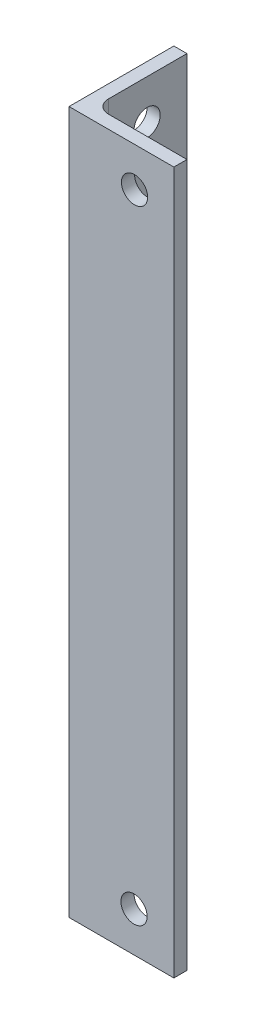
ISO-10303-21;
HEADER;
FILE_DESCRIPTION(('STEP AP214'),'2;1');
FILE_NAME('part.step','',(''),(''),'','','');
FILE_SCHEMA(('AUTOMOTIVE_DESIGN { 1 0 10303 214 1 1 1 1 }'));
ENDSEC;
DATA;
#1=APPLICATION_CONTEXT('core data for automotive mechanical design processes');
#2=APPLICATION_PROTOCOL_DEFINITION('international standard','automotive_design',2000,#1);
#3=PRODUCT_CONTEXT('',#1,'mechanical');
#4=PRODUCT('Part','Part','',(#3));
#5=PRODUCT_RELATED_PRODUCT_CATEGORY('part','',(#4));
#6=PRODUCT_DEFINITION_FORMATION('','',#4);
#7=PRODUCT_DEFINITION_CONTEXT('part definition',#1,'design');
#8=PRODUCT_DEFINITION('design','',#6,#7);
#9=PRODUCT_DEFINITION_SHAPE('','',#8);
#10=(LENGTH_UNIT() NAMED_UNIT(*) SI_UNIT(.MILLI.,.METRE.));
#11=(NAMED_UNIT(*) PLANE_ANGLE_UNIT() SI_UNIT($,.RADIAN.));
#12=(NAMED_UNIT(*) SI_UNIT($,.STERADIAN.) SOLID_ANGLE_UNIT());
#13=UNCERTAINTY_MEASURE_WITH_UNIT(LENGTH_MEASURE(1.E-05),#10,'distance_accuracy_value','');
#14=(GEOMETRIC_REPRESENTATION_CONTEXT(3) GLOBAL_UNCERTAINTY_ASSIGNED_CONTEXT((#13)) GLOBAL_UNIT_ASSIGNED_CONTEXT((#10,
#11,#12)) REPRESENTATION_CONTEXT('',''));
#15=CARTESIAN_POINT('',(0.,0.,0.));
#16=DIRECTION('',(0.,0.,1.));
#17=DIRECTION('',(1.,0.,0.));
#18=AXIS2_PLACEMENT_3D('',#15,#16,#17);
#19=CARTESIAN_POINT('',(0.,170.18,25.4));
#20=DIRECTION('',(1.,0.,0.));
#21=DIRECTION('',(0.,0.,-1.));
#22=AXIS2_PLACEMENT_3D('',#19,#20,#21);
#23=PLANE('',#22);
#24=CARTESIAN_POINT('',(0.,9.65199999999999,9.652));
#25=DIRECTION('',(-1.,0.,0.));
#26=DIRECTION('',(0.,0.,1.));
#27=AXIS2_PLACEMENT_3D('',#24,#25,#26);
#28=CIRCLE('',#27,3.175);
#29=CARTESIAN_POINT('',(0.,9.65199999999999,12.827));
#30=VERTEX_POINT('',#29);
#31=EDGE_CURVE('E147',#30,#30,#28,.T.);
#32=ORIENTED_EDGE('',*,*,#31,.F.);
#33=EDGE_LOOP('',(#32));
#34=FACE_BOUND('',#33,.T.);
#35=CARTESIAN_POINT('',(0.,160.528,9.652));
#36=DIRECTION('',(-1.,0.,0.));
#37=DIRECTION('',(0.,0.,1.));
#38=AXIS2_PLACEMENT_3D('',#35,#36,#37);
#39=CIRCLE('',#38,3.175);
#40=CARTESIAN_POINT('',(0.,160.528,12.827));
#41=VERTEX_POINT('',#40);
#42=EDGE_CURVE('E137',#41,#41,#39,.T.);
#43=ORIENTED_EDGE('',*,*,#42,.F.);
#44=EDGE_LOOP('',(#43));
#45=FACE_BOUND('',#44,.T.);
#46=DIRECTION('',(0.,0.,1.));
#47=VECTOR('',#46,1.);
#48=CARTESIAN_POINT('',(0.,0.,25.4));
#49=LINE('',#48,#47);
#50=CARTESIAN_POINT('',(0.,0.,0.));
#51=VERTEX_POINT('',#50);
#52=CARTESIAN_POINT('',(0.,0.,25.4));
#53=VERTEX_POINT('',#52);
#54=EDGE_CURVE('E125',#51,#53,#49,.T.);
#55=ORIENTED_EDGE('',*,*,#54,.T.);
#56=DIRECTION('',(0.,-1.,0.));
#57=VECTOR('',#56,1.);
#58=CARTESIAN_POINT('',(0.,170.18,25.4));
#59=LINE('',#58,#57);
#60=CARTESIAN_POINT('',(0.,170.18,25.4));
#61=VERTEX_POINT('',#60);
#62=EDGE_CURVE('E106',#61,#53,#59,.T.);
#63=ORIENTED_EDGE('',*,*,#62,.F.);
#64=DIRECTION('',(0.,0.,1.));
#65=VECTOR('',#64,1.);
#66=CARTESIAN_POINT('',(0.,170.18,25.4));
#67=LINE('',#66,#65);
#68=CARTESIAN_POINT('',(0.,170.18,0.));
#69=VERTEX_POINT('',#68);
#70=EDGE_CURVE('E113',#69,#61,#67,.T.);
#71=ORIENTED_EDGE('',*,*,#70,.F.);
#72=DIRECTION('',(0.,-1.,0.));
#73=VECTOR('',#72,1.);
#74=CARTESIAN_POINT('',(0.,170.18,0.));
#75=LINE('',#74,#73);
#76=EDGE_CURVE('E156',#69,#51,#75,.T.);
#77=ORIENTED_EDGE('',*,*,#76,.T.);
#78=EDGE_LOOP('',(#55,#63,#71,#77));
#79=FACE_BOUND('',#78,.T.);
#80=ADVANCED_FACE('F41',(#34,#45,#79),#23,.F.);
#81=CARTESIAN_POINT('',(25.4,170.18,25.4));
#82=DIRECTION('',(0.,0.,-1.));
#83=DIRECTION('',(-1.,0.,0.));
#84=AXIS2_PLACEMENT_3D('',#81,#82,#83);
#85=PLANE('',#84);
#86=CARTESIAN_POINT('',(15.875,160.655,25.4));
#87=DIRECTION('',(0.,0.,-1.));
#88=DIRECTION('',(-1.,0.,0.));
#89=AXIS2_PLACEMENT_3D('',#86,#87,#88);
#90=CIRCLE('',#89,3.175);
#91=CARTESIAN_POINT('',(12.7,160.655,25.4));
#92=VERTEX_POINT('',#91);
#93=EDGE_CURVE('E223',#92,#92,#90,.T.);
#94=ORIENTED_EDGE('',*,*,#93,.T.);
#95=EDGE_LOOP('',(#94));
#96=FACE_BOUND('',#95,.T.);
#97=CARTESIAN_POINT('',(15.748,9.65199999999999,25.4));
#98=DIRECTION('',(0.,0.,-1.));
#99=DIRECTION('',(-1.,0.,0.));
#100=AXIS2_PLACEMENT_3D('',#97,#98,#99);
#101=CIRCLE('',#100,3.175);
#102=CARTESIAN_POINT('',(12.573,9.65199999999999,25.4));
#103=VERTEX_POINT('',#102);
#104=EDGE_CURVE('E222',#103,#103,#101,.T.);
#105=ORIENTED_EDGE('',*,*,#104,.T.);
#106=EDGE_LOOP('',(#105));
#107=FACE_BOUND('',#106,.T.);
#108=DIRECTION('',(1.,0.,0.));
#109=VECTOR('',#108,1.);
#110=CARTESIAN_POINT('',(25.4,0.,25.4));
#111=LINE('',#110,#109);
#112=CARTESIAN_POINT('',(25.4,0.,25.4));
#113=VERTEX_POINT('',#112);
#114=EDGE_CURVE('E140',#53,#113,#111,.T.);
#115=ORIENTED_EDGE('',*,*,#114,.T.);
#116=DIRECTION('',(0.,-1.,0.));
#117=VECTOR('',#116,1.);
#118=CARTESIAN_POINT('',(25.4,170.18,25.4));
#119=LINE('',#118,#117);
#120=CARTESIAN_POINT('',(25.4,170.18,25.4));
#121=VERTEX_POINT('',#120);
#122=EDGE_CURVE('E109',#121,#113,#119,.T.);
#123=ORIENTED_EDGE('',*,*,#122,.F.);
#124=DIRECTION('',(1.,0.,0.));
#125=VECTOR('',#124,1.);
#126=CARTESIAN_POINT('',(25.4,170.18,25.4));
#127=LINE('',#126,#125);
#128=EDGE_CURVE('E102',#61,#121,#127,.T.);
#129=ORIENTED_EDGE('',*,*,#128,.F.);
#130=ORIENTED_EDGE('',*,*,#62,.T.);
#131=EDGE_LOOP('',(#115,#123,#129,#130));
#132=FACE_BOUND('',#131,.T.);
#133=ADVANCED_FACE('F104',(#96,#107,#132),#85,.F.);
#134=CARTESIAN_POINT('',(25.4,170.18,22.225));
#135=DIRECTION('',(-1.,0.,0.));
#136=DIRECTION('',(0.,0.,1.));
#137=AXIS2_PLACEMENT_3D('',#134,#135,#136);
#138=PLANE('',#137);
#139=DIRECTION('',(0.,0.,-1.));
#140=VECTOR('',#139,1.);
#141=CARTESIAN_POINT('',(25.4,0.,22.225));
#142=LINE('',#141,#140);
#143=CARTESIAN_POINT('',(25.4,0.,22.225));
#144=VERTEX_POINT('',#143);
#145=EDGE_CURVE('E159',#113,#144,#142,.T.);
#146=ORIENTED_EDGE('',*,*,#145,.T.);
#147=DIRECTION('',(0.,-1.,0.));
#148=VECTOR('',#147,1.);
#149=CARTESIAN_POINT('',(25.4,170.18,22.225));
#150=LINE('',#149,#148);
#151=CARTESIAN_POINT('',(25.4,170.18,22.225));
#152=VERTEX_POINT('',#151);
#153=EDGE_CURVE('E130',#152,#144,#150,.T.);
#154=ORIENTED_EDGE('',*,*,#153,.F.);
#155=DIRECTION('',(0.,0.,-1.));
#156=VECTOR('',#155,1.);
#157=CARTESIAN_POINT('',(25.4,170.18,22.225));
#158=LINE('',#157,#156);
#159=EDGE_CURVE('E112',#121,#152,#158,.T.);
#160=ORIENTED_EDGE('',*,*,#159,.F.);
#161=ORIENTED_EDGE('',*,*,#122,.T.);
#162=EDGE_LOOP('',(#146,#154,#160,#161));
#163=FACE_BOUND('',#162,.T.);
#164=ADVANCED_FACE('F175',(#163),#138,.F.);
#165=CARTESIAN_POINT('',(3.175,170.18,22.225));
#166=DIRECTION('',(0.,0.,1.));
#167=DIRECTION('',(1.,0.,0.));
#168=AXIS2_PLACEMENT_3D('',#165,#166,#167);
#169=PLANE('',#168);
#170=CARTESIAN_POINT('',(15.875,160.655,22.225));
#171=DIRECTION('',(0.,0.,-1.));
#172=DIRECTION('',(-1.,0.,0.));
#173=AXIS2_PLACEMENT_3D('',#170,#171,#172);
#174=CIRCLE('',#173,3.175);
#175=CARTESIAN_POINT('',(12.7,160.655,22.225));
#176=VERTEX_POINT('',#175);
#177=EDGE_CURVE('E217',#176,#176,#174,.T.);
#178=ORIENTED_EDGE('',*,*,#177,.F.);
#179=EDGE_LOOP('',(#178));
#180=FACE_BOUND('',#179,.T.);
#181=CARTESIAN_POINT('',(15.748,9.65199999999999,22.225));
#182=DIRECTION('',(0.,0.,-1.));
#183=DIRECTION('',(-1.,0.,0.));
#184=AXIS2_PLACEMENT_3D('',#181,#182,#183);
#185=CIRCLE('',#184,3.175);
#186=CARTESIAN_POINT('',(12.573,9.65199999999999,22.225));
#187=VERTEX_POINT('',#186);
#188=EDGE_CURVE('E220',#187,#187,#185,.T.);
#189=ORIENTED_EDGE('',*,*,#188,.F.);
#190=EDGE_LOOP('',(#189));
#191=FACE_BOUND('',#190,.T.);
#192=DIRECTION('',(-1.,0.,0.));
#193=VECTOR('',#192,1.);
#194=CARTESIAN_POINT('',(3.175,0.,22.225));
#195=LINE('',#194,#193);
#196=CARTESIAN_POINT('',(6.35,0.,22.225));
#197=VERTEX_POINT('',#196);
#198=EDGE_CURVE('E161',#144,#197,#195,.T.);
#199=ORIENTED_EDGE('',*,*,#198,.T.);
#200=DIRECTION('',(0.,-1.,0.));
#201=VECTOR('',#200,1.);
#202=CARTESIAN_POINT('',(6.35,170.18,22.225));
#203=LINE('',#202,#201);
#204=CARTESIAN_POINT('',(6.35,170.18,22.225));
#205=VERTEX_POINT('',#204);
#206=EDGE_CURVE('E58',#197,#205,#203,.F.);
#207=ORIENTED_EDGE('',*,*,#206,.T.);
#208=DIRECTION('',(-1.,0.,0.));
#209=VECTOR('',#208,1.);
#210=CARTESIAN_POINT('',(3.175,170.18,22.225));
#211=LINE('',#210,#209);
#212=EDGE_CURVE('E152',#152,#205,#211,.T.);
#213=ORIENTED_EDGE('',*,*,#212,.F.);
#214=ORIENTED_EDGE('',*,*,#153,.T.);
#215=EDGE_LOOP('',(#199,#207,#213,#214));
#216=FACE_BOUND('',#215,.T.);
#217=ADVANCED_FACE('F171',(#180,#191,#216),#169,.F.);
#218=CARTESIAN_POINT('',(3.175,170.18,0.));
#219=DIRECTION('',(-1.,0.,0.));
#220=DIRECTION('',(0.,0.,1.));
#221=AXIS2_PLACEMENT_3D('',#218,#219,#220);
#222=PLANE('',#221);
#223=CARTESIAN_POINT('',(3.175,9.65199999999999,9.652));
#224=DIRECTION('',(-1.,0.,0.));
#225=DIRECTION('',(0.,0.,1.));
#226=AXIS2_PLACEMENT_3D('',#223,#224,#225);
#227=CIRCLE('',#226,3.175);
#228=CARTESIAN_POINT('',(3.175,9.65199999999999,12.827));
#229=VERTEX_POINT('',#228);
#230=EDGE_CURVE('E45',#229,#229,#227,.T.);
#231=ORIENTED_EDGE('',*,*,#230,.T.);
#232=EDGE_LOOP('',(#231));
#233=FACE_BOUND('',#232,.T.);
#234=CARTESIAN_POINT('',(3.175,160.528,9.652));
#235=DIRECTION('',(-1.,0.,0.));
#236=DIRECTION('',(0.,0.,1.));
#237=AXIS2_PLACEMENT_3D('',#234,#235,#236);
#238=CIRCLE('',#237,3.175);
#239=CARTESIAN_POINT('',(3.175,160.528,12.827));
#240=VERTEX_POINT('',#239);
#241=EDGE_CURVE('E135',#240,#240,#238,.T.);
#242=ORIENTED_EDGE('',*,*,#241,.T.);
#243=EDGE_LOOP('',(#242));
#244=FACE_BOUND('',#243,.T.);
#245=DIRECTION('',(0.,0.,-1.));
#246=VECTOR('',#245,1.);
#247=CARTESIAN_POINT('',(3.175,170.18,0.));
#248=LINE('',#247,#246);
#249=CARTESIAN_POINT('',(3.175,170.18,19.05));
#250=VERTEX_POINT('',#249);
#251=CARTESIAN_POINT('',(3.175,170.18,0.));
#252=VERTEX_POINT('',#251);
#253=EDGE_CURVE('E154',#250,#252,#248,.T.);
#254=ORIENTED_EDGE('',*,*,#253,.F.);
#255=DIRECTION('',(0.,-1.,0.));
#256=VECTOR('',#255,1.);
#257=CARTESIAN_POINT('',(3.175,0.,19.05));
#258=LINE('',#257,#256);
#259=CARTESIAN_POINT('',(3.175,0.,19.05));
#260=VERTEX_POINT('',#259);
#261=EDGE_CURVE('E126',#250,#260,#258,.T.);
#262=ORIENTED_EDGE('',*,*,#261,.T.);
#263=DIRECTION('',(0.,0.,-1.));
#264=VECTOR('',#263,1.);
#265=CARTESIAN_POINT('',(3.175,0.,0.));
#266=LINE('',#265,#264);
#267=CARTESIAN_POINT('',(3.175,0.,0.));
#268=VERTEX_POINT('',#267);
#269=EDGE_CURVE('E163',#260,#268,#266,.T.);
#270=ORIENTED_EDGE('',*,*,#269,.T.);
#271=DIRECTION('',(0.,-1.,0.));
#272=VECTOR('',#271,1.);
#273=CARTESIAN_POINT('',(3.175,170.18,0.));
#274=LINE('',#273,#272);
#275=EDGE_CURVE('E167',#252,#268,#274,.T.);
#276=ORIENTED_EDGE('',*,*,#275,.F.);
#277=EDGE_LOOP('',(#254,#262,#270,#276));
#278=FACE_BOUND('',#277,.T.);
#279=ADVANCED_FACE('F181',(#233,#244,#278),#222,.F.);
#280=CARTESIAN_POINT('',(0.,170.18,0.));
#281=DIRECTION('',(0.,0.,1.));
#282=DIRECTION('',(1.,0.,0.));
#283=AXIS2_PLACEMENT_3D('',#280,#281,#282);
#284=PLANE('',#283);
#285=DIRECTION('',(-1.,0.,0.));
#286=VECTOR('',#285,1.);
#287=CARTESIAN_POINT('',(0.,0.,0.));
#288=LINE('',#287,#286);
#289=EDGE_CURVE('E122',#268,#51,#288,.T.);
#290=ORIENTED_EDGE('',*,*,#289,.T.);
#291=ORIENTED_EDGE('',*,*,#76,.F.);
#292=DIRECTION('',(-1.,0.,0.));
#293=VECTOR('',#292,1.);
#294=CARTESIAN_POINT('',(0.,170.18,0.));
#295=LINE('',#294,#293);
#296=EDGE_CURVE('E118',#252,#69,#295,.T.);
#297=ORIENTED_EDGE('',*,*,#296,.F.);
#298=ORIENTED_EDGE('',*,*,#275,.T.);
#299=EDGE_LOOP('',(#290,#291,#297,#298));
#300=FACE_BOUND('',#299,.T.);
#301=ADVANCED_FACE('F185',(#300),#284,.F.);
#302=CARTESIAN_POINT('',(0.,170.18,0.));
#303=DIRECTION('',(0.,-1.,0.));
#304=DIRECTION('',(0.,0.,-1.));
#305=AXIS2_PLACEMENT_3D('',#302,#303,#304);
#306=PLANE('',#305);
#307=ORIENTED_EDGE('',*,*,#70,.T.);
#308=ORIENTED_EDGE('',*,*,#128,.T.);
#309=ORIENTED_EDGE('',*,*,#159,.T.);
#310=ORIENTED_EDGE('',*,*,#212,.T.);
#311=CARTESIAN_POINT('',(6.35,170.18,19.05));
#312=DIRECTION('',(0.,-1.,0.));
#313=DIRECTION('',(0.,0.,-1.));
#314=AXIS2_PLACEMENT_3D('',#311,#312,#313);
#315=CIRCLE('',#314,3.175);
#316=EDGE_CURVE('E11',#205,#250,#315,.T.);
#317=ORIENTED_EDGE('',*,*,#316,.T.);
#318=ORIENTED_EDGE('',*,*,#253,.T.);
#319=ORIENTED_EDGE('',*,*,#296,.T.);
#320=EDGE_LOOP('',(#307,#308,#309,#310,#317,#318,#319));
#321=FACE_BOUND('',#320,.T.);
#322=ADVANCED_FACE('F116',(#321),#306,.F.);
#323=CARTESIAN_POINT('',(0.,0.,0.));
#324=DIRECTION('',(0.,-1.,0.));
#325=DIRECTION('',(0.,0.,-1.));
#326=AXIS2_PLACEMENT_3D('',#323,#324,#325);
#327=PLANE('',#326);
#328=ORIENTED_EDGE('',*,*,#54,.F.);
#329=ORIENTED_EDGE('',*,*,#289,.F.);
#330=ORIENTED_EDGE('',*,*,#269,.F.);
#331=CARTESIAN_POINT('',(6.35,0.,19.05));
#332=DIRECTION('',(0.,-1.,0.));
#333=DIRECTION('',(0.,0.,-1.));
#334=AXIS2_PLACEMENT_3D('',#331,#332,#333);
#335=CIRCLE('',#334,3.175);
#336=EDGE_CURVE('E50',#260,#197,#335,.F.);
#337=ORIENTED_EDGE('',*,*,#336,.T.);
#338=ORIENTED_EDGE('',*,*,#198,.F.);
#339=ORIENTED_EDGE('',*,*,#145,.F.);
#340=ORIENTED_EDGE('',*,*,#114,.F.);
#341=EDGE_LOOP('',(#328,#329,#330,#337,#338,#339,#340));
#342=FACE_BOUND('',#341,.T.);
#343=ADVANCED_FACE('F174',(#342),#327,.T.);
#344=CARTESIAN_POINT('',(6.35,170.18,19.05));
#345=DIRECTION('',(0.,1.,0.));
#346=DIRECTION('',(0.,0.,1.));
#347=AXIS2_PLACEMENT_3D('',#344,#345,#346);
#348=CYLINDRICAL_SURFACE('',#347,3.175);
#349=ORIENTED_EDGE('',*,*,#316,.F.);
#350=ORIENTED_EDGE('',*,*,#206,.F.);
#351=ORIENTED_EDGE('',*,*,#336,.F.);
#352=ORIENTED_EDGE('',*,*,#261,.F.);
#353=EDGE_LOOP('',(#349,#350,#351,#352));
#354=FACE_BOUND('',#353,.T.);
#355=ADVANCED_FACE('F43',(#354),#348,.F.);
#356=CARTESIAN_POINT('',(25.4,160.528,9.652));
#357=DIRECTION('',(-1.,0.,0.));
#358=DIRECTION('',(0.,0.,1.));
#359=AXIS2_PLACEMENT_3D('',#356,#357,#358);
#360=CYLINDRICAL_SURFACE('',#359,3.175);
#361=ORIENTED_EDGE('',*,*,#42,.T.);
#362=EDGE_LOOP('',(#361));
#363=FACE_BOUND('',#362,.T.);
#364=ORIENTED_EDGE('',*,*,#241,.F.);
#365=EDGE_LOOP('',(#364));
#366=FACE_BOUND('',#365,.T.);
#367=ADVANCED_FACE('F244',(#363,#366),#360,.F.);
#368=CARTESIAN_POINT('',(25.4,9.65199999999999,9.652));
#369=DIRECTION('',(-1.,0.,0.));
#370=DIRECTION('',(0.,0.,1.));
#371=AXIS2_PLACEMENT_3D('',#368,#369,#370);
#372=CYLINDRICAL_SURFACE('',#371,3.175);
#373=ORIENTED_EDGE('',*,*,#31,.T.);
#374=EDGE_LOOP('',(#373));
#375=FACE_BOUND('',#374,.T.);
#376=ORIENTED_EDGE('',*,*,#230,.F.);
#377=EDGE_LOOP('',(#376));
#378=FACE_BOUND('',#377,.T.);
#379=ADVANCED_FACE('F237',(#375,#378),#372,.F.);
#380=CARTESIAN_POINT('',(15.748,9.65199999999999,25.4));
#381=DIRECTION('',(0.,0.,-1.));
#382=DIRECTION('',(-1.,0.,0.));
#383=AXIS2_PLACEMENT_3D('',#380,#381,#382);
#384=CYLINDRICAL_SURFACE('',#383,3.175);
#385=ORIENTED_EDGE('',*,*,#104,.F.);
#386=EDGE_LOOP('',(#385));
#387=FACE_BOUND('',#386,.T.);
#388=ORIENTED_EDGE('',*,*,#188,.T.);
#389=EDGE_LOOP('',(#388));
#390=FACE_BOUND('',#389,.T.);
#391=ADVANCED_FACE('F231',(#387,#390),#384,.F.);
#392=CARTESIAN_POINT('',(15.875,160.655,25.4));
#393=DIRECTION('',(0.,0.,-1.));
#394=DIRECTION('',(-1.,0.,0.));
#395=AXIS2_PLACEMENT_3D('',#392,#393,#394);
#396=CYLINDRICAL_SURFACE('',#395,3.175);
#397=ORIENTED_EDGE('',*,*,#93,.F.);
#398=EDGE_LOOP('',(#397));
#399=FACE_BOUND('',#398,.T.);
#400=ORIENTED_EDGE('',*,*,#177,.T.);
#401=EDGE_LOOP('',(#400));
#402=FACE_BOUND('',#401,.T.);
#403=ADVANCED_FACE('F230',(#399,#402),#396,.F.);
#404=CLOSED_SHELL('',(#80,#133,#164,#217,#279,#301,#322,#343,#355,#367,#379,#391,#403));
#405=MANIFOLD_SOLID_BREP('B2',#404);
#406=ADVANCED_BREP_SHAPE_REPRESENTATION('',(#18,#405),#14);
#407=SHAPE_DEFINITION_REPRESENTATION(#9,#406);
ENDSEC;
END-ISO-10303-21;
